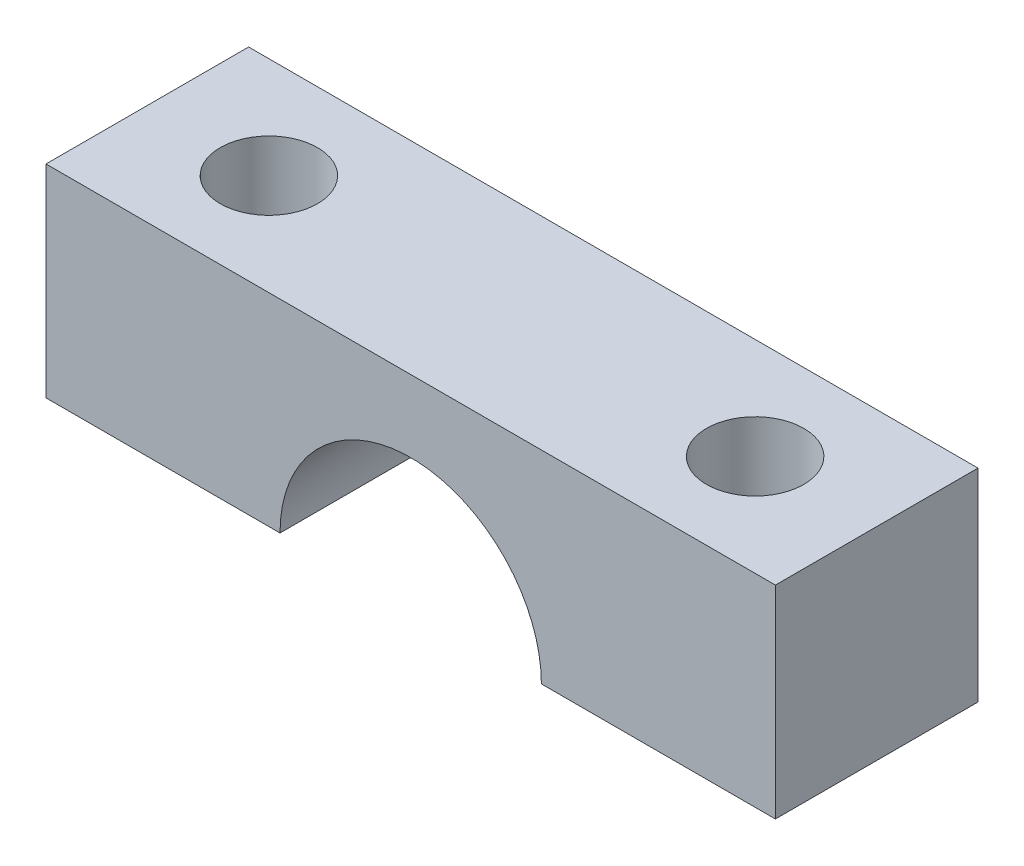
ISO-10303-21;
HEADER;
FILE_DESCRIPTION(('STEP AP214'),'2;1');
FILE_NAME('part.step','',(''),(''),'','','');
FILE_SCHEMA(('AUTOMOTIVE_DESIGN { 1 0 10303 214 1 1 1 1 }'));
ENDSEC;
DATA;
#1=APPLICATION_CONTEXT('core data for automotive mechanical design processes');
#2=APPLICATION_PROTOCOL_DEFINITION('international standard','automotive_design',2000,#1);
#3=PRODUCT_CONTEXT('',#1,'mechanical');
#4=PRODUCT('Part','Part','',(#3));
#5=PRODUCT_RELATED_PRODUCT_CATEGORY('part','',(#4));
#6=PRODUCT_DEFINITION_FORMATION('','',#4);
#7=PRODUCT_DEFINITION_CONTEXT('part definition',#1,'design');
#8=PRODUCT_DEFINITION('design','',#6,#7);
#9=PRODUCT_DEFINITION_SHAPE('','',#8);
#10=(LENGTH_UNIT() NAMED_UNIT(*) SI_UNIT(.MILLI.,.METRE.));
#11=(NAMED_UNIT(*) PLANE_ANGLE_UNIT() SI_UNIT($,.RADIAN.));
#12=(NAMED_UNIT(*) SI_UNIT($,.STERADIAN.) SOLID_ANGLE_UNIT());
#13=UNCERTAINTY_MEASURE_WITH_UNIT(LENGTH_MEASURE(1.E-05),#10,'distance_accuracy_value','');
#14=(GEOMETRIC_REPRESENTATION_CONTEXT(3) GLOBAL_UNCERTAINTY_ASSIGNED_CONTEXT((#13)) GLOBAL_UNIT_ASSIGNED_CONTEXT((#10,
#11,#12)) REPRESENTATION_CONTEXT('',''));
#15=CARTESIAN_POINT('',(0.,0.,0.));
#16=DIRECTION('',(0.,0.,1.));
#17=DIRECTION('',(1.,0.,0.));
#18=AXIS2_PLACEMENT_3D('',#15,#16,#17);
#19=CARTESIAN_POINT('',(0.,0.,5.));
#20=DIRECTION('',(0.,0.,-1.));
#21=DIRECTION('',(-1.,0.,0.));
#22=AXIS2_PLACEMENT_3D('',#19,#20,#21);
#23=CYLINDRICAL_SURFACE('',#22,3.225);
#24=CARTESIAN_POINT('',(0.,0.,0.));
#25=DIRECTION('',(0.,0.,-1.));
#26=DIRECTION('',(1.,0.,0.));
#27=AXIS2_PLACEMENT_3D('',#24,#25,#26);
#28=CIRCLE('',#27,3.225);
#29=CARTESIAN_POINT('',(-3.225,0.,0.));
#30=VERTEX_POINT('',#29);
#31=CARTESIAN_POINT('',(3.225,0.,0.));
#32=VERTEX_POINT('',#31);
#33=EDGE_CURVE('E117',#30,#32,#28,.T.);
#34=ORIENTED_EDGE('',*,*,#33,.T.);
#35=DIRECTION('',(0.,0.,-1.));
#36=VECTOR('',#35,1.);
#37=CARTESIAN_POINT('',(3.225,0.,5.));
#38=LINE('',#37,#36);
#39=CARTESIAN_POINT('',(3.225,0.,5.));
#40=VERTEX_POINT('',#39);
#41=EDGE_CURVE('E11',#40,#32,#38,.T.);
#42=ORIENTED_EDGE('',*,*,#41,.F.);
#43=CARTESIAN_POINT('',(0.,0.,5.));
#44=DIRECTION('',(0.,0.,-1.));
#45=DIRECTION('',(1.,0.,0.));
#46=AXIS2_PLACEMENT_3D('',#43,#44,#45);
#47=CIRCLE('',#46,3.225);
#48=CARTESIAN_POINT('',(-3.225,0.,5.));
#49=VERTEX_POINT('',#48);
#50=EDGE_CURVE('E128',#49,#40,#47,.T.);
#51=ORIENTED_EDGE('',*,*,#50,.F.);
#52=DIRECTION('',(0.,0.,-1.));
#53=VECTOR('',#52,1.);
#54=CARTESIAN_POINT('',(-3.225,0.,5.));
#55=LINE('',#54,#53);
#56=EDGE_CURVE('E113',#49,#30,#55,.T.);
#57=ORIENTED_EDGE('',*,*,#56,.T.);
#58=EDGE_LOOP('',(#34,#42,#51,#57));
#59=FACE_BOUND('',#58,.T.);
#60=ADVANCED_FACE('F33',(#59),#23,.F.);
#61=CARTESIAN_POINT('',(3.225,0.,5.));
#62=DIRECTION('',(0.,1.,0.));
#63=DIRECTION('',(-1.,0.,0.));
#64=AXIS2_PLACEMENT_3D('',#61,#62,#63);
#65=PLANE('',#64);
#66=CARTESIAN_POINT('',(6.,0.,2.5));
#67=DIRECTION('',(0.,1.,0.));
#68=DIRECTION('',(0.,0.,-1.));
#69=AXIS2_PLACEMENT_3D('',#66,#67,#68);
#70=CIRCLE('',#69,1.2);
#71=CARTESIAN_POINT('',(6.,0.,1.3));
#72=VERTEX_POINT('',#71);
#73=EDGE_CURVE('E177',#72,#72,#70,.T.);
#74=ORIENTED_EDGE('',*,*,#73,.T.);
#75=EDGE_LOOP('',(#74));
#76=FACE_BOUND('',#75,.T.);
#77=DIRECTION('',(1.,0.,0.));
#78=VECTOR('',#77,1.);
#79=CARTESIAN_POINT('',(3.225,0.,0.));
#80=LINE('',#79,#78);
#81=CARTESIAN_POINT('',(9.,0.,0.));
#82=VERTEX_POINT('',#81);
#83=EDGE_CURVE('E120',#32,#82,#80,.T.);
#84=ORIENTED_EDGE('',*,*,#83,.T.);
#85=DIRECTION('',(0.,0.,-1.));
#86=VECTOR('',#85,1.);
#87=CARTESIAN_POINT('',(9.,0.,5.));
#88=LINE('',#87,#86);
#89=CARTESIAN_POINT('',(9.,0.,5.));
#90=VERTEX_POINT('',#89);
#91=EDGE_CURVE('E41',#90,#82,#88,.T.);
#92=ORIENTED_EDGE('',*,*,#91,.F.);
#93=DIRECTION('',(1.,0.,0.));
#94=VECTOR('',#93,1.);
#95=CARTESIAN_POINT('',(3.225,0.,5.));
#96=LINE('',#95,#94);
#97=EDGE_CURVE('E86',#40,#90,#96,.T.);
#98=ORIENTED_EDGE('',*,*,#97,.F.);
#99=ORIENTED_EDGE('',*,*,#41,.T.);
#100=EDGE_LOOP('',(#84,#92,#98,#99));
#101=FACE_BOUND('',#100,.T.);
#102=ADVANCED_FACE('F154',(#76,#101),#65,.F.);
#103=CARTESIAN_POINT('',(9.,0.,5.));
#104=DIRECTION('',(-1.,0.,0.));
#105=DIRECTION('',(0.,0.,1.));
#106=AXIS2_PLACEMENT_3D('',#103,#104,#105);
#107=PLANE('',#106);
#108=DIRECTION('',(0.,1.,0.));
#109=VECTOR('',#108,1.);
#110=CARTESIAN_POINT('',(9.,0.,0.));
#111=LINE('',#110,#109);
#112=CARTESIAN_POINT('',(9.,5.,0.));
#113=VERTEX_POINT('',#112);
#114=EDGE_CURVE('E123',#82,#113,#111,.T.);
#115=ORIENTED_EDGE('',*,*,#114,.T.);
#116=DIRECTION('',(0.,0.,-1.));
#117=VECTOR('',#116,1.);
#118=CARTESIAN_POINT('',(9.,5.,5.));
#119=LINE('',#118,#117);
#120=CARTESIAN_POINT('',(9.,5.,5.));
#121=VERTEX_POINT('',#120);
#122=EDGE_CURVE('E108',#121,#113,#119,.T.);
#123=ORIENTED_EDGE('',*,*,#122,.F.);
#124=DIRECTION('',(0.,1.,0.));
#125=VECTOR('',#124,1.);
#126=CARTESIAN_POINT('',(9.,0.,5.));
#127=LINE('',#126,#125);
#128=EDGE_CURVE('E99',#90,#121,#127,.T.);
#129=ORIENTED_EDGE('',*,*,#128,.F.);
#130=ORIENTED_EDGE('',*,*,#91,.T.);
#131=EDGE_LOOP('',(#115,#123,#129,#130));
#132=FACE_BOUND('',#131,.T.);
#133=ADVANCED_FACE('F134',(#132),#107,.F.);
#134=CARTESIAN_POINT('',(9.,5.,5.));
#135=DIRECTION('',(0.,-1.,0.));
#136=DIRECTION('',(0.,0.,-1.));
#137=AXIS2_PLACEMENT_3D('',#134,#135,#136);
#138=PLANE('',#137);
#139=CARTESIAN_POINT('',(-6.,5.,2.5));
#140=DIRECTION('',(0.,1.,0.));
#141=DIRECTION('',(0.,0.,1.));
#142=AXIS2_PLACEMENT_3D('',#139,#140,#141);
#143=CIRCLE('',#142,1.2);
#144=CARTESIAN_POINT('',(-6.,5.,3.7));
#145=VERTEX_POINT('',#144);
#146=EDGE_CURVE('E121',#145,#145,#143,.T.);
#147=ORIENTED_EDGE('',*,*,#146,.F.);
#148=EDGE_LOOP('',(#147));
#149=FACE_BOUND('',#148,.T.);
#150=CARTESIAN_POINT('',(6.,5.,2.5));
#151=DIRECTION('',(0.,1.,0.));
#152=DIRECTION('',(0.,0.,-1.));
#153=AXIS2_PLACEMENT_3D('',#150,#151,#152);
#154=CIRCLE('',#153,1.2);
#155=CARTESIAN_POINT('',(6.,5.,1.3));
#156=VERTEX_POINT('',#155);
#157=EDGE_CURVE('E174',#156,#156,#154,.T.);
#158=ORIENTED_EDGE('',*,*,#157,.F.);
#159=EDGE_LOOP('',(#158));
#160=FACE_BOUND('',#159,.T.);
#161=DIRECTION('',(-1.,0.,0.));
#162=VECTOR('',#161,1.);
#163=CARTESIAN_POINT('',(9.,5.,0.));
#164=LINE('',#163,#162);
#165=CARTESIAN_POINT('',(-9.,5.,0.));
#166=VERTEX_POINT('',#165);
#167=EDGE_CURVE('E107',#113,#166,#164,.T.);
#168=ORIENTED_EDGE('',*,*,#167,.T.);
#169=DIRECTION('',(0.,0.,-1.));
#170=VECTOR('',#169,1.);
#171=CARTESIAN_POINT('',(-9.,5.,5.));
#172=LINE('',#171,#170);
#173=CARTESIAN_POINT('',(-9.,5.,5.));
#174=VERTEX_POINT('',#173);
#175=EDGE_CURVE('E104',#174,#166,#172,.T.);
#176=ORIENTED_EDGE('',*,*,#175,.F.);
#177=DIRECTION('',(-1.,0.,0.));
#178=VECTOR('',#177,1.);
#179=CARTESIAN_POINT('',(9.,5.,5.));
#180=LINE('',#179,#178);
#181=EDGE_CURVE('E93',#121,#174,#180,.T.);
#182=ORIENTED_EDGE('',*,*,#181,.F.);
#183=ORIENTED_EDGE('',*,*,#122,.T.);
#184=EDGE_LOOP('',(#168,#176,#182,#183));
#185=FACE_BOUND('',#184,.T.);
#186=ADVANCED_FACE('F105',(#149,#160,#185),#138,.F.);
#187=CARTESIAN_POINT('',(-9.,0.,5.));
#188=DIRECTION('',(1.,0.,0.));
#189=DIRECTION('',(0.,0.,-1.));
#190=AXIS2_PLACEMENT_3D('',#187,#188,#189);
#191=PLANE('',#190);
#192=DIRECTION('',(0.,-1.,0.));
#193=VECTOR('',#192,1.);
#194=CARTESIAN_POINT('',(-9.,0.,0.));
#195=LINE('',#194,#193);
#196=CARTESIAN_POINT('',(-9.,0.,0.));
#197=VERTEX_POINT('',#196);
#198=EDGE_CURVE('E72',#166,#197,#195,.T.);
#199=ORIENTED_EDGE('',*,*,#198,.T.);
#200=DIRECTION('',(0.,0.,-1.));
#201=VECTOR('',#200,1.);
#202=CARTESIAN_POINT('',(-9.,0.,5.));
#203=LINE('',#202,#201);
#204=CARTESIAN_POINT('',(-9.,0.,5.));
#205=VERTEX_POINT('',#204);
#206=EDGE_CURVE('E109',#205,#197,#203,.T.);
#207=ORIENTED_EDGE('',*,*,#206,.F.);
#208=DIRECTION('',(0.,-1.,0.));
#209=VECTOR('',#208,1.);
#210=CARTESIAN_POINT('',(-9.,0.,5.));
#211=LINE('',#210,#209);
#212=EDGE_CURVE('E97',#174,#205,#211,.T.);
#213=ORIENTED_EDGE('',*,*,#212,.F.);
#214=ORIENTED_EDGE('',*,*,#175,.T.);
#215=EDGE_LOOP('',(#199,#207,#213,#214));
#216=FACE_BOUND('',#215,.T.);
#217=ADVANCED_FACE('F111',(#216),#191,.F.);
#218=CARTESIAN_POINT('',(-3.225,0.,5.));
#219=DIRECTION('',(0.,1.,0.));
#220=DIRECTION('',(-1.,0.,0.));
#221=AXIS2_PLACEMENT_3D('',#218,#219,#220);
#222=PLANE('',#221);
#223=CARTESIAN_POINT('',(-6.,0.,2.5));
#224=DIRECTION('',(0.,1.,0.));
#225=DIRECTION('',(0.,0.,1.));
#226=AXIS2_PLACEMENT_3D('',#223,#224,#225);
#227=CIRCLE('',#226,1.2);
#228=CARTESIAN_POINT('',(-6.,0.,3.7));
#229=VERTEX_POINT('',#228);
#230=EDGE_CURVE('E176',#229,#229,#227,.T.);
#231=ORIENTED_EDGE('',*,*,#230,.T.);
#232=EDGE_LOOP('',(#231));
#233=FACE_BOUND('',#232,.T.);
#234=DIRECTION('',(1.,0.,0.));
#235=VECTOR('',#234,1.);
#236=CARTESIAN_POINT('',(-3.225,0.,0.));
#237=LINE('',#236,#235);
#238=EDGE_CURVE('E78',#197,#30,#237,.T.);
#239=ORIENTED_EDGE('',*,*,#238,.T.);
#240=ORIENTED_EDGE('',*,*,#56,.F.);
#241=DIRECTION('',(1.,0.,0.));
#242=VECTOR('',#241,1.);
#243=CARTESIAN_POINT('',(-3.225,0.,5.));
#244=LINE('',#243,#242);
#245=EDGE_CURVE('E49',#205,#49,#244,.T.);
#246=ORIENTED_EDGE('',*,*,#245,.F.);
#247=ORIENTED_EDGE('',*,*,#206,.T.);
#248=EDGE_LOOP('',(#239,#240,#246,#247));
#249=FACE_BOUND('',#248,.T.);
#250=ADVANCED_FACE('F141',(#233,#249),#222,.F.);
#251=CARTESIAN_POINT('',(0.,0.,5.));
#252=DIRECTION('',(0.,0.,1.));
#253=DIRECTION('',(1.,0.,0.));
#254=AXIS2_PLACEMENT_3D('',#251,#252,#253);
#255=PLANE('',#254);
#256=ORIENTED_EDGE('',*,*,#50,.T.);
#257=ORIENTED_EDGE('',*,*,#97,.T.);
#258=ORIENTED_EDGE('',*,*,#128,.T.);
#259=ORIENTED_EDGE('',*,*,#181,.T.);
#260=ORIENTED_EDGE('',*,*,#212,.T.);
#261=ORIENTED_EDGE('',*,*,#245,.T.);
#262=EDGE_LOOP('',(#256,#257,#258,#259,#260,#261));
#263=FACE_BOUND('',#262,.T.);
#264=ADVANCED_FACE('F95',(#263),#255,.T.);
#265=CARTESIAN_POINT('',(0.,0.,0.));
#266=DIRECTION('',(0.,0.,1.));
#267=DIRECTION('',(1.,0.,0.));
#268=AXIS2_PLACEMENT_3D('',#265,#266,#267);
#269=PLANE('',#268);
#270=ORIENTED_EDGE('',*,*,#33,.F.);
#271=ORIENTED_EDGE('',*,*,#238,.F.);
#272=ORIENTED_EDGE('',*,*,#198,.F.);
#273=ORIENTED_EDGE('',*,*,#167,.F.);
#274=ORIENTED_EDGE('',*,*,#114,.F.);
#275=ORIENTED_EDGE('',*,*,#83,.F.);
#276=EDGE_LOOP('',(#270,#271,#272,#273,#274,#275));
#277=FACE_BOUND('',#276,.T.);
#278=ADVANCED_FACE('F137',(#277),#269,.F.);
#279=CARTESIAN_POINT('',(-6.,5.,2.5));
#280=DIRECTION('',(0.,-1.,0.));
#281=DIRECTION('',(0.,0.,-1.));
#282=AXIS2_PLACEMENT_3D('',#279,#280,#281);
#283=CYLINDRICAL_SURFACE('',#282,1.2);
#284=ORIENTED_EDGE('',*,*,#146,.T.);
#285=EDGE_LOOP('',(#284));
#286=FACE_BOUND('',#285,.T.);
#287=ORIENTED_EDGE('',*,*,#230,.F.);
#288=EDGE_LOOP('',(#287));
#289=FACE_BOUND('',#288,.T.);
#290=ADVANCED_FACE('F185',(#286,#289),#283,.F.);
#291=CARTESIAN_POINT('',(6.,5.,2.5));
#292=DIRECTION('',(0.,-1.,0.));
#293=DIRECTION('',(0.,0.,-1.));
#294=AXIS2_PLACEMENT_3D('',#291,#292,#293);
#295=CYLINDRICAL_SURFACE('',#294,1.2);
#296=ORIENTED_EDGE('',*,*,#157,.T.);
#297=EDGE_LOOP('',(#296));
#298=FACE_BOUND('',#297,.T.);
#299=ORIENTED_EDGE('',*,*,#73,.F.);
#300=EDGE_LOOP('',(#299));
#301=FACE_BOUND('',#300,.T.);
#302=ADVANCED_FACE('F188',(#298,#301),#295,.F.);
#303=CLOSED_SHELL('',(#60,#102,#133,#186,#217,#250,#264,#278,#290,#302));
#304=MANIFOLD_SOLID_BREP('B2',#303);
#305=ADVANCED_BREP_SHAPE_REPRESENTATION('',(#18,#304),#14);
#306=SHAPE_DEFINITION_REPRESENTATION(#9,#305);
ENDSEC;
END-ISO-10303-21;
